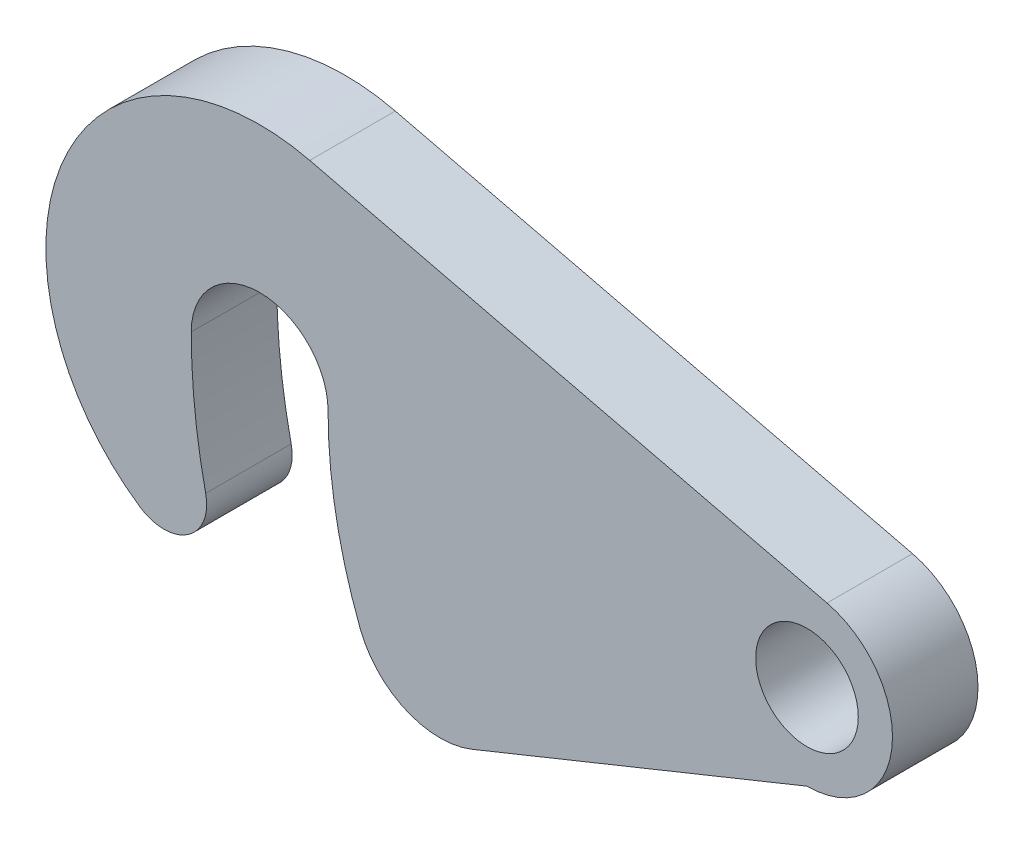
ISO-10303-21;
HEADER;
FILE_DESCRIPTION(('STEP AP214'),'2;1');
FILE_NAME('part.step','',(''),(''),'','','');
FILE_SCHEMA(('AUTOMOTIVE_DESIGN { 1 0 10303 214 1 1 1 1 }'));
ENDSEC;
DATA;
#1=APPLICATION_CONTEXT('core data for automotive mechanical design processes');
#2=APPLICATION_PROTOCOL_DEFINITION('international standard','automotive_design',2000,#1);
#3=PRODUCT_CONTEXT('',#1,'mechanical');
#4=PRODUCT('Part','Part','',(#3));
#5=PRODUCT_RELATED_PRODUCT_CATEGORY('part','',(#4));
#6=PRODUCT_DEFINITION_FORMATION('','',#4);
#7=PRODUCT_DEFINITION_CONTEXT('part definition',#1,'design');
#8=PRODUCT_DEFINITION('design','',#6,#7);
#9=PRODUCT_DEFINITION_SHAPE('','',#8);
#10=(LENGTH_UNIT() NAMED_UNIT(*) SI_UNIT(.MILLI.,.METRE.));
#11=(NAMED_UNIT(*) PLANE_ANGLE_UNIT() SI_UNIT($,.RADIAN.));
#12=(NAMED_UNIT(*) SI_UNIT($,.STERADIAN.) SOLID_ANGLE_UNIT());
#13=UNCERTAINTY_MEASURE_WITH_UNIT(LENGTH_MEASURE(1.E-05),#10,'distance_accuracy_value','');
#14=(GEOMETRIC_REPRESENTATION_CONTEXT(3) GLOBAL_UNCERTAINTY_ASSIGNED_CONTEXT((#13)) GLOBAL_UNIT_ASSIGNED_CONTEXT((#10,
#11,#12)) REPRESENTATION_CONTEXT('',''));
#15=CARTESIAN_POINT('',(0.,0.,0.));
#16=DIRECTION('',(0.,0.,1.));
#17=DIRECTION('',(1.,0.,0.));
#18=AXIS2_PLACEMENT_3D('',#15,#16,#17);
#19=CARTESIAN_POINT('',(0.,0.,5.));
#20=DIRECTION('',(0.,0.,-1.));
#21=DIRECTION('',(-1.,0.,0.));
#22=AXIS2_PLACEMENT_3D('',#19,#20,#21);
#23=CYLINDRICAL_SURFACE('',#22,56.);
#24=CARTESIAN_POINT('',(0.,0.,-5.));
#25=DIRECTION('',(0.,0.,1.));
#26=DIRECTION('',(1.,0.,0.));
#27=AXIS2_PLACEMENT_3D('',#24,#25,#26);
#28=CIRCLE('',#27,56.);
#29=CARTESIAN_POINT('',(-56.,0.,-5.));
#30=VERTEX_POINT('',#29);
#31=CARTESIAN_POINT('',(-52.2392101761059,-20.1758499245169,-5.));
#32=VERTEX_POINT('',#31);
#33=EDGE_CURVE('E155',#30,#32,#28,.T.);
#34=ORIENTED_EDGE('',*,*,#33,.T.);
#35=DIRECTION('',(0.,0.,-1.));
#36=VECTOR('',#35,1.);
#37=CARTESIAN_POINT('',(-52.2392101761059,-20.1758499245169,5.));
#38=LINE('',#37,#36);
#39=CARTESIAN_POINT('',(-52.2392101761059,-20.1758499245169,5.));
#40=VERTEX_POINT('',#39);
#41=EDGE_CURVE('E11',#40,#32,#38,.T.);
#42=ORIENTED_EDGE('',*,*,#41,.F.);
#43=CARTESIAN_POINT('',(0.,0.,5.));
#44=DIRECTION('',(0.,0.,1.));
#45=DIRECTION('',(1.,0.,0.));
#46=AXIS2_PLACEMENT_3D('',#43,#44,#45);
#47=CIRCLE('',#46,56.);
#48=CARTESIAN_POINT('',(-56.,0.,5.));
#49=VERTEX_POINT('',#48);
#50=EDGE_CURVE('E236',#49,#40,#47,.T.);
#51=ORIENTED_EDGE('',*,*,#50,.F.);
#52=DIRECTION('',(0.,0.,-1.));
#53=VECTOR('',#52,1.);
#54=CARTESIAN_POINT('',(-56.,0.,5.));
#55=LINE('',#54,#53);
#56=EDGE_CURVE('E61',#49,#30,#55,.T.);
#57=ORIENTED_EDGE('',*,*,#56,.T.);
#58=EDGE_LOOP('',(#34,#42,#51,#57));
#59=FACE_BOUND('',#58,.T.);
#60=ADVANCED_FACE('F43',(#59),#23,.T.);
#61=CARTESIAN_POINT('',(-42.9107797875156,-16.5730195808532,5.));
#62=DIRECTION('',(0.,0.,-1.));
#63=DIRECTION('',(-1.,0.,0.));
#64=AXIS2_PLACEMENT_3D('',#61,#62,#63);
#65=CYLINDRICAL_SURFACE('',#64,10.);
#66=CARTESIAN_POINT('',(-42.9107797875156,-16.5730195808532,-5.));
#67=DIRECTION('',(0.,0.,1.));
#68=DIRECTION('',(1.,0.,0.));
#69=AXIS2_PLACEMENT_3D('',#66,#67,#68);
#70=CIRCLE('',#69,10.);
#71=CARTESIAN_POINT('',(-39.1603826360782,-25.8431070241566,-5.));
#72=VERTEX_POINT('',#71);
#73=EDGE_CURVE('E158',#32,#72,#70,.T.);
#74=ORIENTED_EDGE('',*,*,#73,.T.);
#75=DIRECTION('',(0.,0.,-1.));
#76=VECTOR('',#75,1.);
#77=CARTESIAN_POINT('',(-39.1603826360782,-25.8431070241566,5.));
#78=LINE('',#77,#76);
#79=CARTESIAN_POINT('',(-39.1603826360782,-25.8431070241566,5.));
#80=VERTEX_POINT('',#79);
#81=EDGE_CURVE('E53',#80,#72,#78,.T.);
#82=ORIENTED_EDGE('',*,*,#81,.F.);
#83=CARTESIAN_POINT('',(-42.9107797875156,-16.5730195808532,5.));
#84=DIRECTION('',(0.,0.,1.));
#85=DIRECTION('',(1.,0.,0.));
#86=AXIS2_PLACEMENT_3D('',#83,#84,#85);
#87=CIRCLE('',#86,10.);
#88=EDGE_CURVE('E102',#40,#80,#87,.T.);
#89=ORIENTED_EDGE('',*,*,#88,.F.);
#90=ORIENTED_EDGE('',*,*,#41,.T.);
#91=EDGE_LOOP('',(#74,#82,#89,#90));
#92=FACE_BOUND('',#91,.T.);
#93=ADVANCED_FACE('F209',(#92),#65,.T.);
#94=CARTESIAN_POINT('',(3.47665095409401,-8.59345212064905,5.));
#95=DIRECTION('',(0.375039715143736,-0.927008744330336,0.));
#96=DIRECTION('',(0.927008744330336,0.375039715143736,0.));
#97=AXIS2_PLACEMENT_3D('',#94,#95,#96);
#98=PLANE('',#97);
#99=DIRECTION('',(-0.927008744330336,-0.375039715143736,0.));
#100=VECTOR('',#99,1.);
#101=CARTESIAN_POINT('',(3.47665095409401,-8.59345212064905,-5.));
#102=LINE('',#101,#100);
#103=CARTESIAN_POINT('',(0.,-10.,-5.));
#104=VERTEX_POINT('',#103);
#105=EDGE_CURVE('E162',#104,#72,#102,.T.);
#106=ORIENTED_EDGE('',*,*,#105,.F.);
#107=DIRECTION('',(0.,0.,-1.));
#108=VECTOR('',#107,1.);
#109=CARTESIAN_POINT('',(0.,-10.,5.));
#110=LINE('',#109,#108);
#111=CARTESIAN_POINT('',(0.,-10.,5.));
#112=VERTEX_POINT('',#111);
#113=EDGE_CURVE('E200',#112,#104,#110,.T.);
#114=ORIENTED_EDGE('',*,*,#113,.F.);
#115=DIRECTION('',(-0.927008744330336,-0.375039715143736,0.));
#116=VECTOR('',#115,1.);
#117=CARTESIAN_POINT('',(3.47665095409401,-8.59345212064905,5.));
#118=LINE('',#117,#116);
#119=EDGE_CURVE('E208',#112,#80,#118,.T.);
#120=ORIENTED_EDGE('',*,*,#119,.T.);
#121=ORIENTED_EDGE('',*,*,#81,.T.);
#122=EDGE_LOOP('',(#106,#114,#120,#121));
#123=FACE_BOUND('',#122,.T.);
#124=ADVANCED_FACE('F206',(#123),#98,.T.);
#125=CARTESIAN_POINT('',(0.,0.,5.));
#126=DIRECTION('',(0.,0.,-1.));
#127=DIRECTION('',(-1.,0.,0.));
#128=AXIS2_PLACEMENT_3D('',#125,#126,#127);
#129=CYLINDRICAL_SURFACE('',#128,10.);
#130=CARTESIAN_POINT('',(0.,0.,-5.));
#131=DIRECTION('',(0.,0.,1.));
#132=DIRECTION('',(1.,0.,0.));
#133=AXIS2_PLACEMENT_3D('',#130,#131,#132);
#134=CIRCLE('',#133,10.);
#135=CARTESIAN_POINT('',(2.34375,9.72146264393893,-5.));
#136=VERTEX_POINT('',#135);
#137=EDGE_CURVE('E166',#104,#136,#134,.T.);
#138=ORIENTED_EDGE('',*,*,#137,.T.);
#139=DIRECTION('',(0.,0.,-1.));
#140=VECTOR('',#139,1.);
#141=CARTESIAN_POINT('',(2.34375,9.72146264393893,5.));
#142=LINE('',#141,#140);
#143=CARTESIAN_POINT('',(2.34375,9.72146264393893,5.));
#144=VERTEX_POINT('',#143);
#145=EDGE_CURVE('E196',#144,#136,#142,.T.);
#146=ORIENTED_EDGE('',*,*,#145,.F.);
#147=CARTESIAN_POINT('',(0.,0.,5.));
#148=DIRECTION('',(0.,0.,1.));
#149=DIRECTION('',(1.,0.,0.));
#150=AXIS2_PLACEMENT_3D('',#147,#148,#149);
#151=CIRCLE('',#150,10.);
#152=EDGE_CURVE('E226',#112,#144,#151,.T.);
#153=ORIENTED_EDGE('',*,*,#152,.F.);
#154=ORIENTED_EDGE('',*,*,#113,.T.);
#155=EDGE_LOOP('',(#138,#146,#153,#154));
#156=FACE_BOUND('',#155,.T.);
#157=ADVANCED_FACE('F218',(#156),#129,.T.);
#158=CARTESIAN_POINT('',(2.34375,9.72146264393893,5.));
#159=DIRECTION('',(-0.234375,-0.972146264393893,0.));
#160=DIRECTION('',(0.972146264393893,-0.234375,0.));
#161=AXIS2_PLACEMENT_3D('',#158,#159,#160);
#162=PLANE('',#161);
#163=DIRECTION('',(-0.972146264393893,0.234375,0.));
#164=VECTOR('',#163,1.);
#165=CARTESIAN_POINT('',(2.34375,9.72146264393893,-5.));
#166=LINE('',#165,#164);
#167=CARTESIAN_POINT('',(-58.140625,24.3036566098473,-5.));
#168=VERTEX_POINT('',#167);
#169=EDGE_CURVE('E169',#136,#168,#166,.T.);
#170=ORIENTED_EDGE('',*,*,#169,.T.);
#171=DIRECTION('',(0.,0.,-1.));
#172=VECTOR('',#171,1.);
#173=CARTESIAN_POINT('',(-58.140625,24.3036566098473,5.));
#174=LINE('',#173,#172);
#175=CARTESIAN_POINT('',(-58.140625,24.3036566098473,5.));
#176=VERTEX_POINT('',#175);
#177=EDGE_CURVE('E192',#176,#168,#174,.T.);
#178=ORIENTED_EDGE('',*,*,#177,.F.);
#179=DIRECTION('',(-0.972146264393893,0.234375,0.));
#180=VECTOR('',#179,1.);
#181=CARTESIAN_POINT('',(2.34375,9.72146264393893,5.));
#182=LINE('',#181,#180);
#183=EDGE_CURVE('E224',#144,#176,#182,.T.);
#184=ORIENTED_EDGE('',*,*,#183,.F.);
#185=ORIENTED_EDGE('',*,*,#145,.T.);
#186=EDGE_LOOP('',(#170,#178,#184,#185));
#187=FACE_BOUND('',#186,.T.);
#188=ADVANCED_FACE('F222',(#187),#162,.F.);
#189=CARTESIAN_POINT('',(-64.,0.,5.));
#190=DIRECTION('',(0.,0.,-1.));
#191=DIRECTION('',(-1.,0.,0.));
#192=AXIS2_PLACEMENT_3D('',#189,#190,#191);
#193=CYLINDRICAL_SURFACE('',#192,25.);
#194=CARTESIAN_POINT('',(-64.,0.,-5.));
#195=DIRECTION('',(0.,0.,1.));
#196=DIRECTION('',(1.,0.,0.));
#197=AXIS2_PLACEMENT_3D('',#194,#195,#196);
#198=CIRCLE('',#197,25.);
#199=CARTESIAN_POINT('',(-77.994140625,-20.7162744760665,-5.));
#200=VERTEX_POINT('',#199);
#201=EDGE_CURVE('E172',#168,#200,#198,.T.);
#202=ORIENTED_EDGE('',*,*,#201,.T.);
#203=DIRECTION('',(0.,0.,-1.));
#204=VECTOR('',#203,1.);
#205=CARTESIAN_POINT('',(-77.994140625,-20.7162744760665,5.));
#206=LINE('',#205,#204);
#207=CARTESIAN_POINT('',(-77.994140625,-20.7162744760665,5.));
#208=VERTEX_POINT('',#207);
#209=EDGE_CURVE('E131',#208,#200,#206,.T.);
#210=ORIENTED_EDGE('',*,*,#209,.F.);
#211=CARTESIAN_POINT('',(-64.,0.,5.));
#212=DIRECTION('',(0.,0.,1.));
#213=DIRECTION('',(1.,0.,0.));
#214=AXIS2_PLACEMENT_3D('',#211,#212,#213);
#215=CIRCLE('',#214,25.);
#216=EDGE_CURVE('E139',#176,#208,#215,.T.);
#217=ORIENTED_EDGE('',*,*,#216,.F.);
#218=ORIENTED_EDGE('',*,*,#177,.T.);
#219=EDGE_LOOP('',(#202,#210,#217,#218));
#220=FACE_BOUND('',#219,.T.);
#221=ADVANCED_FACE('F267',(#220),#193,.T.);
#222=CARTESIAN_POINT('',(-75.1953125,-16.5730195808532,5.));
#223=DIRECTION('',(0.,0.,-1.));
#224=DIRECTION('',(-1.,0.,0.));
#225=AXIS2_PLACEMENT_3D('',#222,#223,#224);
#226=CYLINDRICAL_SURFACE('',#225,5.);
#227=CARTESIAN_POINT('',(-75.1953125,-16.5730195808532,-5.));
#228=DIRECTION('',(0.,0.,1.));
#229=DIRECTION('',(1.,0.,0.));
#230=AXIS2_PLACEMENT_3D('',#227,#228,#229);
#231=CIRCLE('',#230,5.);
#232=CARTESIAN_POINT('',(-70.3125,-15.4968494782004,-5.));
#233=VERTEX_POINT('',#232);
#234=EDGE_CURVE('E126',#233,#200,#231,.F.);
#235=ORIENTED_EDGE('',*,*,#234,.F.);
#236=DIRECTION('',(0.,0.,-1.));
#237=VECTOR('',#236,1.);
#238=CARTESIAN_POINT('',(-70.3125,-15.4968494782004,5.));
#239=LINE('',#238,#237);
#240=CARTESIAN_POINT('',(-70.3125,-15.4968494782004,5.));
#241=VERTEX_POINT('',#240);
#242=EDGE_CURVE('E121',#241,#233,#239,.T.);
#243=ORIENTED_EDGE('',*,*,#242,.F.);
#244=CARTESIAN_POINT('',(-75.1953125,-16.5730195808532,5.));
#245=DIRECTION('',(0.,0.,1.));
#246=DIRECTION('',(1.,0.,0.));
#247=AXIS2_PLACEMENT_3D('',#244,#245,#246);
#248=CIRCLE('',#247,5.);
#249=EDGE_CURVE('E124',#241,#208,#248,.F.);
#250=ORIENTED_EDGE('',*,*,#249,.T.);
#251=ORIENTED_EDGE('',*,*,#209,.T.);
#252=EDGE_LOOP('',(#235,#243,#250,#251));
#253=FACE_BOUND('',#252,.T.);
#254=ADVANCED_FACE('F123',(#253),#226,.T.);
#255=CARTESIAN_POINT('',(0.,0.,5.));
#256=DIRECTION('',(0.,0.,-1.));
#257=DIRECTION('',(-1.,0.,0.));
#258=AXIS2_PLACEMENT_3D('',#255,#256,#257);
#259=CYLINDRICAL_SURFACE('',#258,72.);
#260=CARTESIAN_POINT('',(0.,0.,-5.));
#261=DIRECTION('',(0.,0.,1.));
#262=DIRECTION('',(1.,0.,0.));
#263=AXIS2_PLACEMENT_3D('',#260,#261,#262);
#264=CIRCLE('',#263,72.);
#265=CARTESIAN_POINT('',(-72.,0.,-5.));
#266=VERTEX_POINT('',#265);
#267=EDGE_CURVE('E178',#266,#233,#264,.T.);
#268=ORIENTED_EDGE('',*,*,#267,.F.);
#269=DIRECTION('',(0.,0.,-1.));
#270=VECTOR('',#269,1.);
#271=CARTESIAN_POINT('',(-72.,0.,5.));
#272=LINE('',#271,#270);
#273=CARTESIAN_POINT('',(-72.,0.,5.));
#274=VERTEX_POINT('',#273);
#275=EDGE_CURVE('E90',#274,#266,#272,.T.);
#276=ORIENTED_EDGE('',*,*,#275,.F.);
#277=CARTESIAN_POINT('',(0.,0.,5.));
#278=DIRECTION('',(0.,0.,1.));
#279=DIRECTION('',(1.,0.,0.));
#280=AXIS2_PLACEMENT_3D('',#277,#278,#279);
#281=CIRCLE('',#280,72.);
#282=EDGE_CURVE('E137',#274,#241,#281,.T.);
#283=ORIENTED_EDGE('',*,*,#282,.T.);
#284=ORIENTED_EDGE('',*,*,#242,.T.);
#285=EDGE_LOOP('',(#268,#276,#283,#284));
#286=FACE_BOUND('',#285,.T.);
#287=ADVANCED_FACE('F143',(#286),#259,.F.);
#288=CARTESIAN_POINT('',(0.,0.,5.));
#289=DIRECTION('',(0.,0.,-1.));
#290=DIRECTION('',(-1.,0.,0.));
#291=AXIS2_PLACEMENT_3D('',#288,#289,#290);
#292=CYLINDRICAL_SURFACE('',#291,6.);
#293=CARTESIAN_POINT('',(0.,0.,5.));
#294=DIRECTION('',(0.,0.,1.));
#295=DIRECTION('',(1.,0.,0.));
#296=AXIS2_PLACEMENT_3D('',#293,#294,#295);
#297=CIRCLE('',#296,6.);
#298=CARTESIAN_POINT('',(6.,0.,5.));
#299=VERTEX_POINT('',#298);
#300=EDGE_CURVE('E185',#299,#299,#297,.T.);
#301=ORIENTED_EDGE('',*,*,#300,.T.);
#302=EDGE_LOOP('',(#301));
#303=FACE_BOUND('',#302,.T.);
#304=CARTESIAN_POINT('',(0.,0.,-5.));
#305=DIRECTION('',(0.,0.,1.));
#306=DIRECTION('',(1.,0.,0.));
#307=AXIS2_PLACEMENT_3D('',#304,#305,#306);
#308=CIRCLE('',#307,6.);
#309=CARTESIAN_POINT('',(6.,0.,-5.));
#310=VERTEX_POINT('',#309);
#311=EDGE_CURVE('E151',#310,#310,#308,.T.);
#312=ORIENTED_EDGE('',*,*,#311,.F.);
#313=EDGE_LOOP('',(#312));
#314=FACE_BOUND('',#313,.T.);
#315=ADVANCED_FACE('F45',(#303,#314),#292,.F.);
#316=CARTESIAN_POINT('',(-64.,0.,5.));
#317=DIRECTION('',(0.,0.,-1.));
#318=DIRECTION('',(-1.,0.,0.));
#319=AXIS2_PLACEMENT_3D('',#316,#317,#318);
#320=CYLINDRICAL_SURFACE('',#319,7.99999999999999);
#321=CARTESIAN_POINT('',(-64.,0.,-5.));
#322=DIRECTION('',(0.,0.,1.));
#323=DIRECTION('',(1.,0.,0.));
#324=AXIS2_PLACEMENT_3D('',#321,#322,#323);
#325=CIRCLE('',#324,7.99999999999999);
#326=EDGE_CURVE('E181',#30,#266,#325,.T.);
#327=ORIENTED_EDGE('',*,*,#326,.F.);
#328=ORIENTED_EDGE('',*,*,#56,.F.);
#329=CARTESIAN_POINT('',(-64.,0.,5.));
#330=DIRECTION('',(0.,0.,1.));
#331=DIRECTION('',(1.,0.,0.));
#332=AXIS2_PLACEMENT_3D('',#329,#330,#331);
#333=CIRCLE('',#332,7.99999999999999);
#334=EDGE_CURVE('E145',#49,#274,#333,.T.);
#335=ORIENTED_EDGE('',*,*,#334,.T.);
#336=ORIENTED_EDGE('',*,*,#275,.T.);
#337=EDGE_LOOP('',(#327,#328,#335,#336));
#338=FACE_BOUND('',#337,.T.);
#339=ADVANCED_FACE('F246',(#338),#320,.F.);
#340=CARTESIAN_POINT('',(0.,0.,5.));
#341=DIRECTION('',(0.,0.,1.));
#342=DIRECTION('',(1.,0.,0.));
#343=AXIS2_PLACEMENT_3D('',#340,#341,#342);
#344=PLANE('',#343);
#345=ORIENTED_EDGE('',*,*,#300,.F.);
#346=EDGE_LOOP('',(#345));
#347=FACE_BOUND('',#346,.T.);
#348=ORIENTED_EDGE('',*,*,#50,.T.);
#349=ORIENTED_EDGE('',*,*,#88,.T.);
#350=ORIENTED_EDGE('',*,*,#119,.F.);
#351=ORIENTED_EDGE('',*,*,#152,.T.);
#352=ORIENTED_EDGE('',*,*,#183,.T.);
#353=ORIENTED_EDGE('',*,*,#216,.T.);
#354=ORIENTED_EDGE('',*,*,#249,.F.);
#355=ORIENTED_EDGE('',*,*,#282,.F.);
#356=ORIENTED_EDGE('',*,*,#334,.F.);
#357=EDGE_LOOP('',(#348,#349,#350,#351,#352,#353,#354,#355,#356));
#358=FACE_BOUND('',#357,.T.);
#359=ADVANCED_FACE('F135',(#347,#358),#344,.T.);
#360=CARTESIAN_POINT('',(0.,0.,-5.));
#361=DIRECTION('',(0.,0.,1.));
#362=DIRECTION('',(1.,0.,0.));
#363=AXIS2_PLACEMENT_3D('',#360,#361,#362);
#364=PLANE('',#363);
#365=ORIENTED_EDGE('',*,*,#311,.T.);
#366=EDGE_LOOP('',(#365));
#367=FACE_BOUND('',#366,.T.);
#368=ORIENTED_EDGE('',*,*,#33,.F.);
#369=ORIENTED_EDGE('',*,*,#326,.T.);
#370=ORIENTED_EDGE('',*,*,#267,.T.);
#371=ORIENTED_EDGE('',*,*,#234,.T.);
#372=ORIENTED_EDGE('',*,*,#201,.F.);
#373=ORIENTED_EDGE('',*,*,#169,.F.);
#374=ORIENTED_EDGE('',*,*,#137,.F.);
#375=ORIENTED_EDGE('',*,*,#105,.T.);
#376=ORIENTED_EDGE('',*,*,#73,.F.);
#377=EDGE_LOOP('',(#368,#369,#370,#371,#372,#373,#374,#375,#376));
#378=FACE_BOUND('',#377,.T.);
#379=ADVANCED_FACE('F213',(#367,#378),#364,.F.);
#380=CLOSED_SHELL('',(#60,#93,#124,#157,#188,#221,#254,#287,#315,#339,#359,#379));
#381=MANIFOLD_SOLID_BREP('B2',#380);
#382=ADVANCED_BREP_SHAPE_REPRESENTATION('',(#18,#381),#14);
#383=SHAPE_DEFINITION_REPRESENTATION(#9,#382);
ENDSEC;
END-ISO-10303-21;
